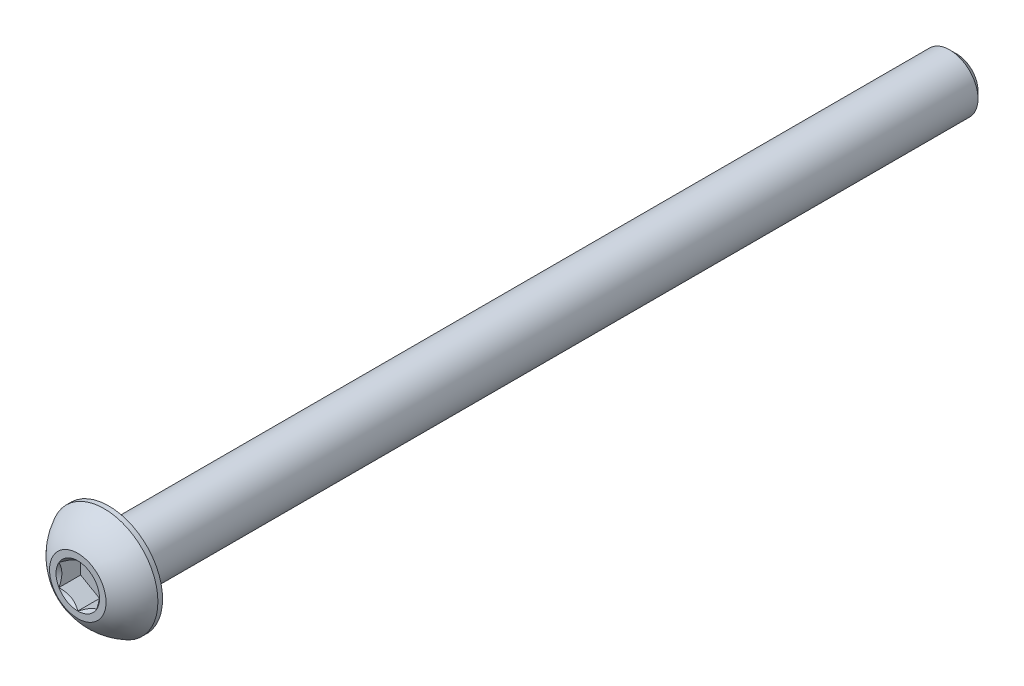
ISO-10303-21;
HEADER;
FILE_DESCRIPTION(('STEP AP214'),'2;1');
FILE_NAME('part.step','',(''),(''),'','','');
FILE_SCHEMA(('AUTOMOTIVE_DESIGN { 1 0 10303 214 1 1 1 1 }'));
ENDSEC;
DATA;
#1=APPLICATION_CONTEXT('core data for automotive mechanical design processes');
#2=APPLICATION_PROTOCOL_DEFINITION('international standard','automotive_design',2000,#1);
#3=PRODUCT_CONTEXT('',#1,'mechanical');
#4=PRODUCT('Part','Part','',(#3));
#5=PRODUCT_RELATED_PRODUCT_CATEGORY('part','',(#4));
#6=PRODUCT_DEFINITION_FORMATION('','',#4);
#7=PRODUCT_DEFINITION_CONTEXT('part definition',#1,'design');
#8=PRODUCT_DEFINITION('design','',#6,#7);
#9=PRODUCT_DEFINITION_SHAPE('','',#8);
#10=(LENGTH_UNIT() NAMED_UNIT(*) SI_UNIT(.MILLI.,.METRE.));
#11=(NAMED_UNIT(*) PLANE_ANGLE_UNIT() SI_UNIT($,.RADIAN.));
#12=(NAMED_UNIT(*) SI_UNIT($,.STERADIAN.) SOLID_ANGLE_UNIT());
#13=UNCERTAINTY_MEASURE_WITH_UNIT(LENGTH_MEASURE(1.E-05),#10,'distance_accuracy_value','');
#14=(GEOMETRIC_REPRESENTATION_CONTEXT(3) GLOBAL_UNCERTAINTY_ASSIGNED_CONTEXT((#13)) GLOBAL_UNIT_ASSIGNED_CONTEXT((#10,
#11,#12)) REPRESENTATION_CONTEXT('',''));
#15=CARTESIAN_POINT('',(0.,0.,0.));
#16=DIRECTION('',(0.,0.,1.));
#17=DIRECTION('',(1.,0.,0.));
#18=AXIS2_PLACEMENT_3D('',#15,#16,#17);
#19=CARTESIAN_POINT('',(0.,0.,-46.65));
#20=DIRECTION('',(0.,0.,1.));
#21=DIRECTION('',(1.,0.,0.));
#22=AXIS2_PLACEMENT_3D('',#19,#20,#21);
#23=PLANE('',#22);
#24=CARTESIAN_POINT('',(0.,0.,-46.65));
#25=DIRECTION('',(0.,0.,1.));
#26=DIRECTION('',(1.,0.,0.));
#27=AXIS2_PLACEMENT_3D('',#24,#25,#26);
#28=CIRCLE('',#27,1.12500000000003);
#29=CARTESIAN_POINT('',(1.12500000000003,0.,-46.65));
#30=VERTEX_POINT('',#29);
#31=EDGE_CURVE('E55',#30,#30,#28,.T.);
#32=ORIENTED_EDGE('',*,*,#31,.F.);
#33=EDGE_LOOP('',(#32));
#34=FACE_BOUND('',#33,.T.);
#35=ADVANCED_FACE('F41',(#34),#23,.F.);
#36=CARTESIAN_POINT('',(0.,0.,-46.65));
#37=DIRECTION('',(0.,0.,1.));
#38=DIRECTION('',(1.,0.,0.));
#39=AXIS2_PLACEMENT_3D('',#36,#37,#38);
#40=CONICAL_SURFACE('',#39,1.12500000000003,0.78539816339743);
#41=CARTESIAN_POINT('',(0.,0.,-46.275));
#42=DIRECTION('',(0.,0.,1.));
#43=DIRECTION('',(1.,0.,0.));
#44=AXIS2_PLACEMENT_3D('',#41,#42,#43);
#45=CIRCLE('',#44,1.50000000000002);
#46=CARTESIAN_POINT('',(1.50000000000002,0.,-46.275));
#47=VERTEX_POINT('',#46);
#48=EDGE_CURVE('E198',#47,#47,#45,.T.);
#49=ORIENTED_EDGE('',*,*,#48,.F.);
#50=EDGE_LOOP('',(#49));
#51=FACE_BOUND('',#50,.T.);
#52=ORIENTED_EDGE('',*,*,#31,.T.);
#53=EDGE_LOOP('',(#52));
#54=FACE_BOUND('',#53,.T.);
#55=ADVANCED_FACE('F205',(#51,#54),#40,.T.);
#56=CARTESIAN_POINT('',(0.,0.,0.));
#57=DIRECTION('',(0.,0.,1.));
#58=DIRECTION('',(1.,0.,0.));
#59=AXIS2_PLACEMENT_3D('',#56,#57,#58);
#60=CYLINDRICAL_SURFACE('',#59,1.50000000000002);
#61=CARTESIAN_POINT('',(0.,0.,-1.65));
#62=DIRECTION('',(0.,0.,1.));
#63=DIRECTION('',(1.,0.,0.));
#64=AXIS2_PLACEMENT_3D('',#61,#62,#63);
#65=CIRCLE('',#64,1.50000000000002);
#66=CARTESIAN_POINT('',(1.50000000000002,0.,-1.65));
#67=VERTEX_POINT('',#66);
#68=EDGE_CURVE('E194',#67,#67,#65,.T.);
#69=ORIENTED_EDGE('',*,*,#68,.F.);
#70=EDGE_LOOP('',(#69));
#71=FACE_BOUND('',#70,.T.);
#72=ORIENTED_EDGE('',*,*,#48,.T.);
#73=EDGE_LOOP('',(#72));
#74=FACE_BOUND('',#73,.T.);
#75=ADVANCED_FACE('F211',(#71,#74),#60,.T.);
#76=CARTESIAN_POINT('',(0.,-2.85,-1.65));
#77=DIRECTION('',(0.,0.,1.));
#78=DIRECTION('',(1.,0.,0.));
#79=AXIS2_PLACEMENT_3D('',#76,#77,#78);
#80=PLANE('',#79);
#81=CARTESIAN_POINT('',(0.,0.,-1.65));
#82=DIRECTION('',(0.,0.,1.));
#83=DIRECTION('',(1.,0.,0.));
#84=AXIS2_PLACEMENT_3D('',#81,#82,#83);
#85=CIRCLE('',#84,2.85);
#86=CARTESIAN_POINT('',(2.85,0.,-1.65));
#87=VERTEX_POINT('',#86);
#88=EDGE_CURVE('E186',#87,#87,#85,.T.);
#89=ORIENTED_EDGE('',*,*,#88,.F.);
#90=EDGE_LOOP('',(#89));
#91=FACE_BOUND('',#90,.T.);
#92=ORIENTED_EDGE('',*,*,#68,.T.);
#93=EDGE_LOOP('',(#92));
#94=FACE_BOUND('',#93,.T.);
#95=ADVANCED_FACE('F216',(#91,#94),#80,.F.);
#96=CARTESIAN_POINT('',(0.,0.,-2.79483288770053));
#97=DIRECTION('',(0.,0.,1.));
#98=DIRECTION('',(0.,-1.,0.));
#99=AXIS2_PLACEMENT_3D('',#96,#97,#98);
#100=SPHERICAL_SURFACE('',#99,3.17192226735975);
#101=CARTESIAN_POINT('',(0.,0.,0.));
#102=DIRECTION('',(0.,0.,1.));
#103=DIRECTION('',(1.,0.,0.));
#104=AXIS2_PLACEMENT_3D('',#101,#102,#103);
#105=CIRCLE('',#104,1.50000000000002);
#106=CARTESIAN_POINT('',(0.,-1.50000000000002,0.));
#107=VERTEX_POINT('',#106);
#108=EDGE_CURVE('E190',#107,#107,#105,.T.);
#109=CARTESIAN_POINT('',(0.,0.,-1.4025));
#110=DIRECTION('',(0.,0.,1.));
#111=DIRECTION('',(1.,0.,0.));
#112=AXIS2_PLACEMENT_3D('',#109,#110,#111);
#113=CIRCLE('',#112,2.85);
#114=CARTESIAN_POINT('',(0.,-2.85,-1.4025));
#115=VERTEX_POINT('',#114);
#116=EDGE_CURVE('E182',#115,#115,#113,.T.);
#117=CARTESIAN_POINT('',(0.,-1.50000000000002,0.));
#118=CARTESIAN_POINT('',(0.,-1.51816007989212,-0.009746569473365));
#119=CARTESIAN_POINT('',(0.,-1.53622513742982,-0.0196701847238474));
#120=CARTESIAN_POINT('',(0.,-1.57215840256596,-0.039867631129312));
#121=CARTESIAN_POINT('',(0.,-1.59002661016439,-0.0501414622842942));
#122=CARTESIAN_POINT('',(0.,-1.62555937019151,-0.0710354648490238));
#123=CARTESIAN_POINT('',(0.,-1.64322392262021,-0.0816556362587711));
#124=CARTESIAN_POINT('',(0.,-1.67834266450263,-0.103238276426968));
#125=CARTESIAN_POINT('',(0.,-1.69579685395637,-0.114200745185417));
#126=CARTESIAN_POINT('',(0.,-1.73048823664555,-0.136463816635607));
#127=CARTESIAN_POINT('',(0.,-1.747725429881,-0.147764419327348));
#128=CARTESIAN_POINT('',(0.,-1.78197627078177,-0.170699464187154));
#129=CARTESIAN_POINT('',(0.,-1.7989899184471,-0.18233390635522));
#130=CARTESIAN_POINT('',(0.,-1.83278720341136,-0.205932209546913));
#131=CARTESIAN_POINT('',(0.,-1.84957084071029,-0.217896070570541));
#132=CARTESIAN_POINT('',(0.,-1.88290172764637,-0.242148665498755));
#133=CARTESIAN_POINT('',(0.,-1.89944897728351,-0.254437399403342));
#134=CARTESIAN_POINT('',(0.,-1.9323008013937,-0.279335070725424));
#135=CARTESIAN_POINT('',(0.,-1.94860537586674,-0.291944008142921));
#136=CARTESIAN_POINT('',(0.,-1.98096565436366,-0.317477295441113));
#137=CARTESIAN_POINT('',(0.,-1.99702135838754,-0.330401645321808));
#138=CARTESIAN_POINT('',(0.,-2.02887779526297,-0.356560846652227));
#139=CARTESIAN_POINT('',(0.,-2.04467852811453,-0.36979569810195));
#140=CARTESIAN_POINT('',(0.,-2.07601901880465,-0.396570873693308));
#141=CARTESIAN_POINT('',(0.,-2.09155877664322,-0.410111197834944));
#142=CARTESIAN_POINT('',(0.,-2.12237141262986,-0.437492173862107));
#143=CARTESIAN_POINT('',(0.,-2.13764429077792,-0.451332825747635));
#144=CARTESIAN_POINT('',(0.,-2.16791736411296,-0.479309198198269));
#145=CARTESIAN_POINT('',(0.,-2.18291755929994,-0.493444918763376));
#146=CARTESIAN_POINT('',(0.,-2.21263956705415,-0.522006057390952));
#147=CARTESIAN_POINT('',(0.,-2.2273613796214,-0.53643147545342));
#148=CARTESIAN_POINT('',(0.,-2.25652102825521,-0.565566527816472));
#149=CARTESIAN_POINT('',(0.,-2.27095886432178,-0.580276162117056));
#150=CARTESIAN_POINT('',(0.,-2.2995450739765,-0.609974057702796));
#151=CARTESIAN_POINT('',(0.,-2.31369344756466,-0.624962318987953));
#152=CARTESIAN_POINT('',(0.,-2.34169535627252,-0.65521177341876));
#153=CARTESIAN_POINT('',(0.,-2.35554889139224,-0.670472966564411));
#154=CARTESIAN_POINT('',(0.,-2.38295585920366,-0.701262485885584));
#155=CARTESIAN_POINT('',(0.,-2.39650929189537,-0.716790812061106));
#156=CARTESIAN_POINT('',(0.,-2.42331090492182,-0.748108697108243));
#157=CARTESIAN_POINT('',(0.,-2.43655908525657,-0.763898255979859));
#158=CARTESIAN_POINT('',(0.,-2.46274515962755,-0.795732606824228));
#159=CARTESIAN_POINT('',(0.,-2.47568305366379,-0.811777398796981));
#160=CARTESIAN_POINT('',(0.,-2.50124363939651,-0.844116119267127));
#161=CARTESIAN_POINT('',(0.,-2.51386633109298,-0.86041004776452));
#162=CARTESIAN_POINT('',(0.,-2.53879171587279,-0.8932408500426));
#163=CARTESIAN_POINT('',(0.,-2.55109440895612,-0.909777723823287));
#164=CARTESIAN_POINT('',(0.,-2.57537512182785,-0.94308813311364));
#165=CARTESIAN_POINT('',(0.,-2.58735314161625,-0.959861668623306));
#166=CARTESIAN_POINT('',(0.,-2.61097995657956,-0.993639027894247));
#167=CARTESIAN_POINT('',(0.,-2.62262875175448,-1.01064285165552));
#168=CARTESIAN_POINT('',(0.,-2.64559269128199,-1.04487432644225));
#169=CARTESIAN_POINT('',(0.,-2.65690783563458,-1.06210197746771));
#170=CARTESIAN_POINT('',(0.,-2.67920017403639,-1.09677456077299));
#171=CARTESIAN_POINT('',(0.,-2.69017736808561,-1.11421949305282));
#172=CARTESIAN_POINT('',(0.,-2.711789634999,-1.14932001019995));
#173=CARTESIAN_POINT('',(0.,-2.72242470786316,-1.16697559506725));
#174=CARTESIAN_POINT('',(0.,-2.74334869082118,-1.20249070903943));
#175=CARTESIAN_POINT('',(0.,-2.75363760091502,-1.22035023814429));
#176=CARTESIAN_POINT('',(0.,-2.77386535089241,-1.25626645340824));
#177=CARTESIAN_POINT('',(0.,-2.78380419077596,-1.27432313956732));
#178=CARTESIAN_POINT('',(0.,-2.80332801615778,-1.31062681184411));
#179=CARTESIAN_POINT('',(0.,-2.81291300165605,-1.32887379796182));
#180=CARTESIAN_POINT('',(0.,-2.83172550494215,-1.3655511220839));
#181=CARTESIAN_POINT('',(0.,-2.84095302272998,-1.38398146008827));
#182=CARTESIAN_POINT('',(0.,-2.85,-1.4025));
#183=B_SPLINE_CURVE_WITH_KNOTS('',3,(#117,#118,#119,#120,#121,#122,#123,#124,#125,#126,#127,
#128,#129,#130,#131,#132,#133,#134,#135,#136,#137,#138,#139,#140,#141,#142,#143,#144,#145,#146,
#147,#148,#149,#150,#151,#152,#153,#154,#155,#156,#157,#158,#159,#160,#161,#162,#163,#164,#165,
#166,#167,#168,#169,#170,#171,#172,#173,#174,#175,#176,#177,#178,#179,#180,#181,#182),
.UNSPECIFIED.,.F.,.F.,(4,2,2,2,2,2,2,2,2,2,2,2,2,2,2,2,2,2,2,2,2,2,2,2,2,2,2,2,2,2,2,2,4),(0.,
0.061829894182698,0.123659788365395,0.185489682548094,0.247319576730792,0.30914947091349,
0.370979365096188,0.432809259278885,0.494639153461583,0.556469047644282,0.618298941826979,
0.680128836009677,0.741958730192375,0.803788624375073,0.865618518557771,0.927448412740469,
0.989278306923166,1.05110820110586,1.11293809528856,1.17476798947126,1.23659788365396,
1.29842777783666,1.36025767201935,1.42208756620205,1.48391746038475,1.54574735456745,
1.60757724875015,1.66940714293284,1.73123703711554,1.79306693129824,1.85489682548094,
1.91672671966364,1.97855661384633),.UNSPECIFIED.);
#184=EDGE_CURVE('BSEAM221',#107,#115,#183,.T.);
#185=ORIENTED_EDGE('',*,*,#108,.F.);
#186=ORIENTED_EDGE('',*,*,#116,.T.);
#187=ORIENTED_EDGE('',*,*,#184,.T.);
#188=ORIENTED_EDGE('',*,*,#184,.F.);
#189=EDGE_LOOP('',(#185,#187,#186,#188));
#190=FACE_BOUND('',#189,.T.);
#191=ADVANCED_FACE('F221',(#190),#100,.T.);
#192=CARTESIAN_POINT('',(0.,-1.50000000000002,0.));
#193=DIRECTION('',(0.,0.,-1.));
#194=DIRECTION('',(-1.,0.,0.));
#195=AXIS2_PLACEMENT_3D('',#192,#193,#194);
#196=PLANE('',#195);
#197=CARTESIAN_POINT('',(0.,0.,0.));
#198=DIRECTION('',(0.,0.,1.));
#199=DIRECTION('',(1.,0.,0.));
#200=AXIS2_PLACEMENT_3D('',#197,#198,#199);
#201=CIRCLE('',#200,1.15470053837925);
#202=CARTESIAN_POINT('',(-0.999999999999997,0.577350269189625,0.));
#203=VERTEX_POINT('',#202);
#204=CARTESIAN_POINT('',(-0.999999999999997,-0.577350269189627,0.));
#205=VERTEX_POINT('',#204);
#206=EDGE_CURVE('E68',#203,#205,#201,.T.);
#207=ORIENTED_EDGE('',*,*,#206,.F.);
#208=CARTESIAN_POINT('',(0.,1.15470053837925,0.));
#209=VERTEX_POINT('',#208);
#210=EDGE_CURVE('E145',#209,#203,#201,.T.);
#211=ORIENTED_EDGE('',*,*,#210,.F.);
#212=CARTESIAN_POINT('',(1.,0.57735026918962,0.));
#213=VERTEX_POINT('',#212);
#214=EDGE_CURVE('E140',#213,#209,#201,.T.);
#215=ORIENTED_EDGE('',*,*,#214,.F.);
#216=CARTESIAN_POINT('',(1.,-0.577350269189621,0.));
#217=VERTEX_POINT('',#216);
#218=EDGE_CURVE('E109',#217,#213,#201,.T.);
#219=ORIENTED_EDGE('',*,*,#218,.F.);
#220=CARTESIAN_POINT('',(0.,-1.15470053837925,0.));
#221=VERTEX_POINT('',#220);
#222=EDGE_CURVE('E100',#221,#217,#201,.T.);
#223=ORIENTED_EDGE('',*,*,#222,.F.);
#224=EDGE_CURVE('E61',#205,#221,#201,.T.);
#225=ORIENTED_EDGE('',*,*,#224,.F.);
#226=EDGE_LOOP('',(#207,#211,#215,#219,#223,#225));
#227=FACE_BOUND('',#226,.T.);
#228=ORIENTED_EDGE('',*,*,#108,.T.);
#229=EDGE_LOOP('',(#228));
#230=FACE_BOUND('',#229,.T.);
#231=ADVANCED_FACE('F137',(#227,#230),#196,.F.);
#232=CARTESIAN_POINT('',(0.,0.,0.));
#233=DIRECTION('',(0.,0.,1.));
#234=DIRECTION('',(1.,0.,0.));
#235=AXIS2_PLACEMENT_3D('',#232,#233,#234);
#236=CYLINDRICAL_SURFACE('',#235,2.85);
#237=ORIENTED_EDGE('',*,*,#116,.F.);
#238=EDGE_LOOP('',(#237));
#239=FACE_BOUND('',#238,.T.);
#240=ORIENTED_EDGE('',*,*,#88,.T.);
#241=EDGE_LOOP('',(#240));
#242=FACE_BOUND('',#241,.T.);
#243=ADVANCED_FACE('F227',(#239,#242),#236,.T.);
#244=CARTESIAN_POINT('',(0.,0.,0.));
#245=DIRECTION('',(0.,0.,1.));
#246=DIRECTION('',(1.,0.,0.));
#247=AXIS2_PLACEMENT_3D('',#244,#245,#246);
#248=CONICAL_SURFACE('',#247,1.15470053837925,0.78539816339745);
#249=ORIENTED_EDGE('',*,*,#218,.T.);
#250=CARTESIAN_POINT('',(1.,-1.15147208646461,0.370385677513857));
#251=CARTESIAN_POINT('',(1.,-1.12343447988551,0.349219919873708));
#252=CARTESIAN_POINT('',(1.,-1.09524064850696,0.328261692175906));
#253=CARTESIAN_POINT('',(1.,-1.03847715644375,0.286846022235618));
#254=CARTESIAN_POINT('',(1.,-1.00990740382974,0.266388706123655));
#255=CARTESIAN_POINT('',(1.,-0.92312089433347,0.205604794954506));
#256=CARTESIAN_POINT('',(1.,-0.864253173759053,0.166192228961395));
#257=CARTESIAN_POINT('',(1.,-0.74080985825804,0.0888206642002037));
#258=CARTESIAN_POINT('',(1.,-0.676100255137802,0.0510730391143415));
#259=CARTESIAN_POINT('',(1.,-0.54344893904912,-0.0179754124487081));
#260=CARTESIAN_POINT('',(1.,-0.475519112027775,-0.049297972153134));
#261=CARTESIAN_POINT('',(1.,-0.373555850333526,-0.0876182211162039));
#262=CARTESIAN_POINT('',(1.,-0.341031989670905,-0.0986164083578424));
#263=CARTESIAN_POINT('',(1.,-0.275199079052291,-0.118001657852638));
#264=CARTESIAN_POINT('',(1.,-0.24188997517393,-0.126388540223299));
#265=CARTESIAN_POINT('',(1.,-0.17524751704299,-0.139974779280982));
#266=CARTESIAN_POINT('',(1.,-0.141925568218173,-0.145229209232031));
#267=CARTESIAN_POINT('',(1.,-0.0749144362322771,-0.152451313429106));
#268=CARTESIAN_POINT('',(1.,-0.0412251978501601,-0.15441848638949));
#269=CARTESIAN_POINT('',(1.,0.0249580992634224,-0.154916801606837));
#270=CARTESIAN_POINT('',(1.,0.0574512826460405,-0.153569732111363));
#271=CARTESIAN_POINT('',(1.,0.122148505701868,-0.147783515501013));
#272=CARTESIAN_POINT('',(1.,0.154352610132927,-0.143345079338462));
#273=CARTESIAN_POINT('',(1.,0.21879989886764,-0.131543169854794));
#274=CARTESIAN_POINT('',(1.,0.251033743268954,-0.124129458961488));
#275=CARTESIAN_POINT('',(1.,0.314797132354919,-0.106771057501322));
#276=CARTESIAN_POINT('',(1.,0.346326735731005,-0.0968265787111677));
#277=CARTESIAN_POINT('',(1.,0.445594187730205,-0.0617765174456608));
#278=CARTESIAN_POINT('',(1.,0.511919139476036,-0.0326791416432731));
#279=CARTESIAN_POINT('',(1.,0.641453244657532,0.0320153296865072));
#280=CARTESIAN_POINT('',(1.,0.704650133126345,0.0676357767152442));
#281=CARTESIAN_POINT('',(1.,0.825428490174987,0.141123901346938));
#282=CARTESIAN_POINT('',(1.,0.883132947867685,0.178791947135466));
#283=CARTESIAN_POINT('',(1.,0.968148853704565,0.237022852943166));
#284=CARTESIAN_POINT('',(1.,0.996120570380285,0.256638475762859));
#285=CARTESIAN_POINT('',(1.,1.05168177729901,0.296388517061273));
#286=CARTESIAN_POINT('',(1.,1.079271369977,0.316522792198834));
#287=CARTESIAN_POINT('',(1.,1.10670185346329,0.336872119072974));
#288=B_SPLINE_CURVE_WITH_KNOTS('',3,(#250,#251,#252,#253,#254,#255,#256,#257,#258,#259,#260,
#261,#262,#263,#264,#265,#266,#267,#268,#269,#270,#271,#272,#273,#274,#275,#276,#277,#278,#279,
#280,#281,#282,#283,#284,#285,#286,#287),.UNSPECIFIED.,.F.,.F.,(4,2,2,2,2,2,2,2,2,2,2,2,2,2,2,2,
2,2,4),(0.,0.10538645908329,0.210799187330123,0.423233611565466,0.647793540908498,
0.871580877738603,0.974493074181413,1.077412358272,1.17846428203204,1.27953161415761,
1.37694086739609,1.47432772585407,1.57343322804292,1.6725304397285,1.88917353996826,
2.10660791038812,2.31323734249842,2.41572589232043,2.51818641476502),.UNSPECIFIED.);
#289=EDGE_CURVE('E11',#217,#213,#288,.T.);
#290=ORIENTED_EDGE('',*,*,#289,.F.);
#291=EDGE_LOOP('',(#249,#290));
#292=FACE_BOUND('',#291,.T.);
#293=ADVANCED_FACE('F113',(#292),#248,.F.);
#294=ORIENTED_EDGE('',*,*,#214,.T.);
#295=CARTESIAN_POINT('',(1.0002,0.577234799135786,0.000115487372616175));
#296=CARTESIAN_POINT('',(0.96581740499282,0.59708559961862,-0.0197220691742649));
#297=CARTESIAN_POINT('',(0.930859881860175,0.617268335009455,-0.0383949793611092));
#298=CARTESIAN_POINT('',(0.85957719704391,0.658423412276684,-0.0725852572768405));
#299=CARTESIAN_POINT('',(0.823245249471016,0.679399671988078,-0.0880835909765399));
#300=CARTESIAN_POINT('',(0.749983386196688,0.721697428470845,-0.114632692857734));
#301=CARTESIAN_POINT('',(0.713072148554585,0.743008141459635,-0.125750226003073));
#302=CARTESIAN_POINT('',(0.63843727068914,0.786098608286185,-0.142880134223817));
#303=CARTESIAN_POINT('',(0.600715911891363,0.80787704494228,-0.148905302533326));
#304=CARTESIAN_POINT('',(0.535707801582065,0.845409494928862,-0.154339445032505));
#305=CARTESIAN_POINT('',(0.508505628471827,0.8611146768966,-0.155143061683267));
#306=CARTESIAN_POINT('',(0.454153959330887,0.892494627706028,-0.153793300583112));
#307=CARTESIAN_POINT('',(0.427004476245123,0.908169389073952,-0.1516392704528));
#308=CARTESIAN_POINT('',(0.345943722673039,0.954969836969509,-0.140883027871528));
#309=CARTESIAN_POINT('',(0.292435859021572,0.985862616452446,-0.127985443584643));
#310=CARTESIAN_POINT('',(0.198523934856568,1.04008269114923,-0.0968592693978221));
#311=CARTESIAN_POINT('',(0.157679476328165,1.0636642502755,-0.0802622022981601));
#312=CARTESIAN_POINT('',(0.0775903626180563,1.10990372163519,-0.042875075314707));
#313=CARTESIAN_POINT('',(0.0383409891295625,1.1325643579843,-0.0220986581825966));
#314=CARTESIAN_POINT('',(-0.000199999999999514,1.15481600843309,0.000115487372613833));
#315=B_SPLINE_CURVE_WITH_KNOTS('',3,(#295,#296,#297,#298,#299,#300,#301,#302,#303,#304,#305,
#306,#307,#308,#309,#310,#311,#312,#313,#314),.UNSPECIFIED.,.F.,.F.,(4,2,2,2,2,2,2,2,2,4),(0.,
0.13323767682856,0.267252229834491,0.399137076269302,0.53068960328077,0.624814864263848,
0.718960890149135,0.907306626112099,1.05710100361789,1.20641411519286),.UNSPECIFIED.);
#316=EDGE_CURVE('E144',#213,#209,#315,.T.);
#317=ORIENTED_EDGE('',*,*,#316,.F.);
#318=EDGE_LOOP('',(#294,#317));
#319=FACE_BOUND('',#318,.T.);
#320=ADVANCED_FACE('F323',(#319),#248,.F.);
#321=ORIENTED_EDGE('',*,*,#210,.T.);
#322=CARTESIAN_POINT('',(0.000200000000000433,1.15481600843309,0.000115487372613877));
#323=CARTESIAN_POINT('',(-0.0341825950071802,1.13496520795025,-0.019722069174267));
#324=CARTESIAN_POINT('',(-0.0691401181398243,1.11478247255942,-0.0383949793611112));
#325=CARTESIAN_POINT('',(-0.140422802956089,1.07362739529219,-0.0725852572768422));
#326=CARTESIAN_POINT('',(-0.176754750528983,1.0526511355808,-0.0880835909765415));
#327=CARTESIAN_POINT('',(-0.25001661380331,1.01035337909803,-0.114632692857735));
#328=CARTESIAN_POINT('',(-0.286927851445413,0.989042666109238,-0.125750226003074));
#329=CARTESIAN_POINT('',(-0.361562729310858,0.945952199282689,-0.142880134223818));
#330=CARTESIAN_POINT('',(-0.399284088108635,0.924173762626594,-0.148905302533327));
#331=CARTESIAN_POINT('',(-0.464292198417932,0.886641312640012,-0.154339445032506));
#332=CARTESIAN_POINT('',(-0.491494371528171,0.870936130672273,-0.155143061683268));
#333=CARTESIAN_POINT('',(-0.54584604066911,0.839556179862846,-0.153793300583113));
#334=CARTESIAN_POINT('',(-0.572995523754874,0.823881418494921,-0.151639270452801));
#335=CARTESIAN_POINT('',(-0.654056277326958,0.777080970599365,-0.140883027871529));
#336=CARTESIAN_POINT('',(-0.707564140978425,0.746188191116428,-0.127985443584644));
#337=CARTESIAN_POINT('',(-0.801476065143429,0.691968116419648,-0.096859269397823));
#338=CARTESIAN_POINT('',(-0.842320523671832,0.66838655729337,-0.080262202298161));
#339=CARTESIAN_POINT('',(-0.922409637381941,0.62214708593368,-0.0428750753147078));
#340=CARTESIAN_POINT('',(-0.961659010870435,0.599486449584574,-0.0220986581825973));
#341=CARTESIAN_POINT('',(-1.0002,0.577234799135787,0.00011548737261326));
#342=B_SPLINE_CURVE_WITH_KNOTS('',3,(#322,#323,#324,#325,#326,#327,#328,#329,#330,#331,#332,
#333,#334,#335,#336,#337,#338,#339,#340,#341),.UNSPECIFIED.,.F.,.F.,(4,2,2,2,2,2,2,2,2,4),(0.,
0.133237676828559,0.26725222983449,0.399137076269299,0.530689603280767,0.624814864263845,
0.718960890149132,0.907306626112096,1.05710100361789,1.20641411519286),.UNSPECIFIED.);
#343=EDGE_CURVE('E151',#209,#203,#342,.T.);
#344=ORIENTED_EDGE('',*,*,#343,.F.);
#345=EDGE_LOOP('',(#321,#344));
#346=FACE_BOUND('',#345,.T.);
#347=ADVANCED_FACE('F156',(#346),#248,.F.);
#348=ORIENTED_EDGE('',*,*,#206,.T.);
#349=CARTESIAN_POINT('',(-0.999999999999996,-1.15147208646461,0.370385677513859));
#350=CARTESIAN_POINT('',(-0.999999999999996,-1.12343447988552,0.34921991987371));
#351=CARTESIAN_POINT('',(-0.999999999999996,-1.09524064850697,0.328261692175907));
#352=CARTESIAN_POINT('',(-0.999999999999996,-1.03847715644376,0.286846022235619));
#353=CARTESIAN_POINT('',(-0.999999999999996,-1.00990740382975,0.266388706123656));
#354=CARTESIAN_POINT('',(-0.999999999999996,-0.923120894333474,0.205604794954507));
#355=CARTESIAN_POINT('',(-0.999999999999997,-0.864253173759057,0.166192228961396));
#356=CARTESIAN_POINT('',(-0.999999999999997,-0.740809858258044,0.0888206642002033));
#357=CARTESIAN_POINT('',(-0.999999999999997,-0.676100255137805,0.0510730391143406));
#358=CARTESIAN_POINT('',(-0.999999999999997,-0.543448939049123,-0.0179754124487097));
#359=CARTESIAN_POINT('',(-0.999999999999997,-0.475519112027777,-0.049297972153136));
#360=CARTESIAN_POINT('',(-0.999999999999997,-0.373555850333528,-0.0876182211162064));
#361=CARTESIAN_POINT('',(-0.999999999999997,-0.341031989670907,-0.098616408357845));
#362=CARTESIAN_POINT('',(-0.999999999999997,-0.275199079052293,-0.118001657852641));
#363=CARTESIAN_POINT('',(-0.999999999999997,-0.241889975173932,-0.126388540223302));
#364=CARTESIAN_POINT('',(-0.999999999999997,-0.175247517042992,-0.139974779280985));
#365=CARTESIAN_POINT('',(-0.999999999999997,-0.141925568218175,-0.145229209232034));
#366=CARTESIAN_POINT('',(-0.999999999999997,-0.0749144362322791,-0.152451313429109));
#367=CARTESIAN_POINT('',(-0.999999999999997,-0.041225197850162,-0.154418486389493));
#368=CARTESIAN_POINT('',(-0.999999999999997,0.0249580992634205,-0.15491680160684));
#369=CARTESIAN_POINT('',(-0.999999999999997,0.0574512826460387,-0.153569732111367));
#370=CARTESIAN_POINT('',(-0.999999999999997,0.122148505701866,-0.147783515501016));
#371=CARTESIAN_POINT('',(-0.999999999999997,0.154352610132926,-0.143345079338466));
#372=CARTESIAN_POINT('',(-0.999999999999997,0.218799898867639,-0.131543169854798));
#373=CARTESIAN_POINT('',(-0.999999999999997,0.251033743268952,-0.124129458961492));
#374=CARTESIAN_POINT('',(-0.999999999999997,0.314797132354917,-0.106771057501326));
#375=CARTESIAN_POINT('',(-0.999999999999997,0.346326735731003,-0.0968265787111716));
#376=CARTESIAN_POINT('',(-0.999999999999997,0.445594187730203,-0.0617765174456648));
#377=CARTESIAN_POINT('',(-0.999999999999997,0.511919139476034,-0.0326791416432772));
#378=CARTESIAN_POINT('',(-0.999999999999997,0.641453244657529,0.0320153296865026));
#379=CARTESIAN_POINT('',(-0.999999999999997,0.704650133126341,0.0676357767152392));
#380=CARTESIAN_POINT('',(-0.999999999999997,0.825428490174983,0.141123901346932));
#381=CARTESIAN_POINT('',(-0.999999999999997,0.883132947867681,0.17879194713546));
#382=CARTESIAN_POINT('',(-0.999999999999997,0.968148853704561,0.23702285294316));
#383=CARTESIAN_POINT('',(-0.999999999999997,0.99612057038028,0.256638475762853));
#384=CARTESIAN_POINT('',(-0.999999999999997,1.05168177729901,0.296388517061267));
#385=CARTESIAN_POINT('',(-0.999999999999997,1.079271369977,0.316522792198828));
#386=CARTESIAN_POINT('',(-0.999999999999997,1.10670185346329,0.336872119072968));
#387=B_SPLINE_CURVE_WITH_KNOTS('',3,(#349,#350,#351,#352,#353,#354,#355,#356,#357,#358,#359,
#360,#361,#362,#363,#364,#365,#366,#367,#368,#369,#370,#371,#372,#373,#374,#375,#376,#377,#378,
#379,#380,#381,#382,#383,#384,#385,#386),.UNSPECIFIED.,.F.,.F.,(4,2,2,2,2,2,2,2,2,2,2,2,2,2,2,2,
2,2,4),(0.,0.10538645908329,0.210799187330124,0.423233611565468,0.647793540908502,
0.871580877738608,0.974493074181418,1.07741235827201,1.17846428203204,1.27953161415762,
1.3769408673961,1.47432772585407,1.57343322804293,1.67253043972851,1.88917353996827,
2.10660791038812,2.31323734249843,2.41572589232044,2.51818641476502),.UNSPECIFIED.);
#388=EDGE_CURVE('E161',#203,#205,#387,.F.);
#389=ORIENTED_EDGE('',*,*,#388,.F.);
#390=EDGE_LOOP('',(#348,#389));
#391=FACE_BOUND('',#390,.T.);
#392=ADVANCED_FACE('F317',(#391),#248,.F.);
#393=ORIENTED_EDGE('',*,*,#224,.T.);
#394=CARTESIAN_POINT('',(-1.0002,-0.577234799135786,0.000115487372612706));
#395=CARTESIAN_POINT('',(-0.965817404992816,-0.59708559961862,-0.0197220691742684));
#396=CARTESIAN_POINT('',(-0.930859881860172,-0.617268335009454,-0.0383949793611125));
#397=CARTESIAN_POINT('',(-0.859577197043907,-0.658423412276684,-0.0725852572768433));
#398=CARTESIAN_POINT('',(-0.823245249471013,-0.679399671988078,-0.0880835909765424));
#399=CARTESIAN_POINT('',(-0.749983386196686,-0.721697428470844,-0.114632692857736));
#400=CARTESIAN_POINT('',(-0.713072148554583,-0.743008141459635,-0.125750226003075));
#401=CARTESIAN_POINT('',(-0.638437270689138,-0.786098608286184,-0.142880134223819));
#402=CARTESIAN_POINT('',(-0.600715911891361,-0.807877044942279,-0.148905302533328));
#403=CARTESIAN_POINT('',(-0.535707801582064,-0.84540949492886,-0.154339445032507));
#404=CARTESIAN_POINT('',(-0.508505628471825,-0.861114676896599,-0.155143061683269));
#405=CARTESIAN_POINT('',(-0.454153959330885,-0.892494627706026,-0.153793300583114));
#406=CARTESIAN_POINT('',(-0.427004476245122,-0.908169389073951,-0.151639270452802));
#407=CARTESIAN_POINT('',(-0.345943722673037,-0.954969836969508,-0.14088302787153));
#408=CARTESIAN_POINT('',(-0.29243585902157,-0.985862616452444,-0.127985443584645));
#409=CARTESIAN_POINT('',(-0.198523934856567,-1.04008269114922,-0.0968592693978238));
#410=CARTESIAN_POINT('',(-0.157679476328164,-1.0636642502755,-0.0802622022981617));
#411=CARTESIAN_POINT('',(-0.0775903626180547,-1.10990372163519,-0.0428750753147082));
#412=CARTESIAN_POINT('',(-0.0383409891295607,-1.1325643579843,-0.0220986581825977));
#413=CARTESIAN_POINT('',(0.000200000000001427,-1.15481600843309,0.000115487372612954));
#414=B_SPLINE_CURVE_WITH_KNOTS('',3,(#394,#395,#396,#397,#398,#399,#400,#401,#402,#403,#404,
#405,#406,#407,#408,#409,#410,#411,#412,#413),.UNSPECIFIED.,.F.,.F.,(4,2,2,2,2,2,2,2,2,4),(0.,
0.133237676828559,0.26725222983449,0.399137076269299,0.530689603280767,0.624814864263845,
0.718960890149132,0.907306626112096,1.05710100361789,1.20641411519286),.UNSPECIFIED.);
#415=EDGE_CURVE('E126',#205,#221,#414,.T.);
#416=ORIENTED_EDGE('',*,*,#415,.F.);
#417=EDGE_LOOP('',(#393,#416));
#418=FACE_BOUND('',#417,.T.);
#419=ADVANCED_FACE('F256',(#418),#248,.F.);
#420=ORIENTED_EDGE('',*,*,#222,.T.);
#421=CARTESIAN_POINT('',(-0.000199999999998591,-1.15481600843309,0.00011548737261301));
#422=CARTESIAN_POINT('',(0.0341825950071819,-1.13496520795025,-0.0197220691742678));
#423=CARTESIAN_POINT('',(0.0691401181398259,-1.11478247255942,-0.0383949793611118));
#424=CARTESIAN_POINT('',(0.14042280295609,-1.07362739529219,-0.0725852572768426));
#425=CARTESIAN_POINT('',(0.176754750528985,-1.05265113558079,-0.0880835909765418));
#426=CARTESIAN_POINT('',(0.250016613803312,-1.01035337909803,-0.114632692857735));
#427=CARTESIAN_POINT('',(0.286927851445415,-0.989042666109238,-0.125750226003074));
#428=CARTESIAN_POINT('',(0.361562729310859,-0.945952199282688,-0.142880134223818));
#429=CARTESIAN_POINT('',(0.399284088108636,-0.924173762626594,-0.148905302533327));
#430=CARTESIAN_POINT('',(0.464292198417933,-0.886641312640012,-0.154339445032506));
#431=CARTESIAN_POINT('',(0.491494371528172,-0.870936130672273,-0.155143061683268));
#432=CARTESIAN_POINT('',(0.545846040669111,-0.839556179862846,-0.153793300583113));
#433=CARTESIAN_POINT('',(0.572995523754875,-0.823881418494921,-0.151639270452801));
#434=CARTESIAN_POINT('',(0.654056277326959,-0.777080970599364,-0.140883027871529));
#435=CARTESIAN_POINT('',(0.707564140978426,-0.746188191116428,-0.127985443584645));
#436=CARTESIAN_POINT('',(0.801476065143431,-0.691968116419647,-0.0968592693978229));
#437=CARTESIAN_POINT('',(0.842320523671833,-0.668386557293369,-0.0802622022981606));
#438=CARTESIAN_POINT('',(0.922409637381943,-0.622147085933678,-0.0428750753147068));
#439=CARTESIAN_POINT('',(0.961659010870437,-0.599486449584572,-0.022098658182596));
#440=CARTESIAN_POINT('',(1.0002,-0.577234799135784,0.00011548737261471));
#441=B_SPLINE_CURVE_WITH_KNOTS('',3,(#421,#422,#423,#424,#425,#426,#427,#428,#429,#430,#431,
#432,#433,#434,#435,#436,#437,#438,#439,#440),.UNSPECIFIED.,.F.,.F.,(4,2,2,2,2,2,2,2,2,4),(0.,
0.133237676828559,0.267252229834489,0.399137076269299,0.530689603280766,0.624814864263844,
0.71896089014913,0.907306626112094,1.05710100361789,1.20641411519286),.UNSPECIFIED.);
#442=EDGE_CURVE('E104',#221,#217,#441,.T.);
#443=ORIENTED_EDGE('',*,*,#442,.F.);
#444=EDGE_LOOP('',(#420,#443));
#445=FACE_BOUND('',#444,.T.);
#446=ADVANCED_FACE('F102',(#445),#248,.F.);
#447=CARTESIAN_POINT('',(1.,-0.577350269189622,-1.155));
#448=DIRECTION('',(0.,0.,1.));
#449=DIRECTION('',(1.,0.,0.));
#450=AXIS2_PLACEMENT_3D('',#447,#448,#449);
#451=PLANE('',#450);
#452=DIRECTION('',(0.866025403784438,0.5,0.));
#453=VECTOR('',#452,1.);
#454=CARTESIAN_POINT('',(0.,-1.15470053837925,-1.155));
#455=LINE('',#454,#453);
#456=CARTESIAN_POINT('',(0.,-1.15470053837925,-1.155));
#457=VERTEX_POINT('',#456);
#458=CARTESIAN_POINT('',(1.,-0.577350269189622,-1.155));
#459=VERTEX_POINT('',#458);
#460=EDGE_CURVE('E125',#457,#459,#455,.T.);
#461=ORIENTED_EDGE('',*,*,#460,.T.);
#462=DIRECTION('',(0.,1.,0.));
#463=VECTOR('',#462,1.);
#464=CARTESIAN_POINT('',(1.,-0.577350269189622,-1.155));
#465=LINE('',#464,#463);
#466=CARTESIAN_POINT('',(1.,0.577350269189624,-1.155));
#467=VERTEX_POINT('',#466);
#468=EDGE_CURVE('E130',#459,#467,#465,.T.);
#469=ORIENTED_EDGE('',*,*,#468,.T.);
#470=DIRECTION('',(-0.866025403784439,0.499999999999999,0.));
#471=VECTOR('',#470,1.);
#472=CARTESIAN_POINT('',(1.,0.577350269189624,-1.155));
#473=LINE('',#472,#471);
#474=CARTESIAN_POINT('',(0.,1.15470053837925,-1.155));
#475=VERTEX_POINT('',#474);
#476=EDGE_CURVE('E301',#467,#475,#473,.T.);
#477=ORIENTED_EDGE('',*,*,#476,.T.);
#478=DIRECTION('',(-0.866025403784439,-0.5,0.));
#479=VECTOR('',#478,1.);
#480=CARTESIAN_POINT('',(0.,1.15470053837925,-1.155));
#481=LINE('',#480,#479);
#482=CARTESIAN_POINT('',(-0.999999999999997,0.577350269189625,-1.155));
#483=VERTEX_POINT('',#482);
#484=EDGE_CURVE('E170',#475,#483,#481,.T.);
#485=ORIENTED_EDGE('',*,*,#484,.T.);
#486=DIRECTION('',(0.,-1.,0.));
#487=VECTOR('',#486,1.);
#488=CARTESIAN_POINT('',(-0.999999999999997,0.577350269189625,-1.155));
#489=LINE('',#488,#487);
#490=CARTESIAN_POINT('',(-0.999999999999997,-0.577350269189624,-1.155));
#491=VERTEX_POINT('',#490);
#492=EDGE_CURVE('E307',#483,#491,#489,.T.);
#493=ORIENTED_EDGE('',*,*,#492,.T.);
#494=DIRECTION('',(0.866025403784439,-0.5,0.));
#495=VECTOR('',#494,1.);
#496=CARTESIAN_POINT('',(-0.999999999999997,-0.577350269189624,-1.155));
#497=LINE('',#496,#495);
#498=EDGE_CURVE('E134',#491,#457,#497,.T.);
#499=ORIENTED_EDGE('',*,*,#498,.T.);
#500=EDGE_LOOP('',(#461,#469,#477,#485,#493,#499));
#501=FACE_BOUND('',#500,.T.);
#502=ADVANCED_FACE('F255',(#501),#451,.T.);
#503=CARTESIAN_POINT('',(1.,-0.577350269189622,-1.155));
#504=DIRECTION('',(1.,0.,0.));
#505=DIRECTION('',(0.,1.,0.));
#506=AXIS2_PLACEMENT_3D('',#503,#504,#505);
#507=PLANE('',#506);
#508=DIRECTION('',(0.,0.,1.));
#509=VECTOR('',#508,1.);
#510=CARTESIAN_POINT('',(1.,-0.577350269189622,-1.155));
#511=LINE('',#510,#509);
#512=EDGE_CURVE('E121',#459,#217,#511,.T.);
#513=ORIENTED_EDGE('',*,*,#512,.T.);
#514=ORIENTED_EDGE('',*,*,#289,.T.);
#515=DIRECTION('',(0.,0.,1.));
#516=VECTOR('',#515,1.);
#517=CARTESIAN_POINT('',(1.,0.577350269189624,-1.155));
#518=LINE('',#517,#516);
#519=EDGE_CURVE('E133',#467,#213,#518,.T.);
#520=ORIENTED_EDGE('',*,*,#519,.F.);
#521=ORIENTED_EDGE('',*,*,#468,.F.);
#522=EDGE_LOOP('',(#513,#514,#520,#521));
#523=FACE_BOUND('',#522,.T.);
#524=ADVANCED_FACE('F128',(#523),#507,.F.);
#525=CARTESIAN_POINT('',(1.,0.577350269189624,-1.155));
#526=DIRECTION('',(0.499999999999999,0.866025403784439,0.));
#527=DIRECTION('',(-0.866025403784439,0.499999999999999,0.));
#528=AXIS2_PLACEMENT_3D('',#525,#526,#527);
#529=PLANE('',#528);
#530=ORIENTED_EDGE('',*,*,#519,.T.);
#531=ORIENTED_EDGE('',*,*,#316,.T.);
#532=DIRECTION('',(0.,0.,1.));
#533=VECTOR('',#532,1.);
#534=CARTESIAN_POINT('',(0.,1.15470053837925,-1.155));
#535=LINE('',#534,#533);
#536=EDGE_CURVE('E166',#475,#209,#535,.T.);
#537=ORIENTED_EDGE('',*,*,#536,.F.);
#538=ORIENTED_EDGE('',*,*,#476,.F.);
#539=EDGE_LOOP('',(#530,#531,#537,#538));
#540=FACE_BOUND('',#539,.T.);
#541=ADVANCED_FACE('F164',(#540),#529,.F.);
#542=CARTESIAN_POINT('',(0.,1.15470053837925,-1.155));
#543=DIRECTION('',(-0.5,0.866025403784439,0.));
#544=DIRECTION('',(-0.866025403784439,-0.5,0.));
#545=AXIS2_PLACEMENT_3D('',#542,#543,#544);
#546=PLANE('',#545);
#547=ORIENTED_EDGE('',*,*,#536,.T.);
#548=ORIENTED_EDGE('',*,*,#343,.T.);
#549=DIRECTION('',(0.,0.,1.));
#550=VECTOR('',#549,1.);
#551=CARTESIAN_POINT('',(-0.999999999999997,0.577350269189625,-1.155));
#552=LINE('',#551,#550);
#553=EDGE_CURVE('E173',#483,#203,#552,.T.);
#554=ORIENTED_EDGE('',*,*,#553,.F.);
#555=ORIENTED_EDGE('',*,*,#484,.F.);
#556=EDGE_LOOP('',(#547,#548,#554,#555));
#557=FACE_BOUND('',#556,.T.);
#558=ADVANCED_FACE('F168',(#557),#546,.F.);
#559=CARTESIAN_POINT('',(-0.999999999999997,0.577350269189625,-1.155));
#560=DIRECTION('',(-1.,0.,0.));
#561=DIRECTION('',(0.,-1.,0.));
#562=AXIS2_PLACEMENT_3D('',#559,#560,#561);
#563=PLANE('',#562);
#564=ORIENTED_EDGE('',*,*,#553,.T.);
#565=ORIENTED_EDGE('',*,*,#388,.T.);
#566=DIRECTION('',(0.,0.,1.));
#567=VECTOR('',#566,1.);
#568=CARTESIAN_POINT('',(-0.999999999999997,-0.577350269189624,-1.155));
#569=LINE('',#568,#567);
#570=EDGE_CURVE('E177',#491,#205,#569,.T.);
#571=ORIENTED_EDGE('',*,*,#570,.F.);
#572=ORIENTED_EDGE('',*,*,#492,.F.);
#573=EDGE_LOOP('',(#564,#565,#571,#572));
#574=FACE_BOUND('',#573,.T.);
#575=ADVANCED_FACE('F278',(#574),#563,.F.);
#576=CARTESIAN_POINT('',(-0.999999999999997,-0.577350269189624,-1.155));
#577=DIRECTION('',(-0.5,-0.866025403784439,0.));
#578=DIRECTION('',(0.866025403784439,-0.5,0.));
#579=AXIS2_PLACEMENT_3D('',#576,#577,#578);
#580=PLANE('',#579);
#581=ORIENTED_EDGE('',*,*,#570,.T.);
#582=ORIENTED_EDGE('',*,*,#415,.T.);
#583=DIRECTION('',(0.,0.,1.));
#584=VECTOR('',#583,1.);
#585=CARTESIAN_POINT('',(0.,-1.15470053837925,-1.155));
#586=LINE('',#585,#584);
#587=EDGE_CURVE('E123',#457,#221,#586,.T.);
#588=ORIENTED_EDGE('',*,*,#587,.F.);
#589=ORIENTED_EDGE('',*,*,#498,.F.);
#590=EDGE_LOOP('',(#581,#582,#588,#589));
#591=FACE_BOUND('',#590,.T.);
#592=ADVANCED_FACE('F236',(#591),#580,.F.);
#593=CARTESIAN_POINT('',(0.,-1.15470053837925,-1.155));
#594=DIRECTION('',(0.500000000000001,-0.866025403784438,0.));
#595=DIRECTION('',(0.866025403784438,0.500000000000001,0.));
#596=AXIS2_PLACEMENT_3D('',#593,#594,#595);
#597=PLANE('',#596);
#598=ORIENTED_EDGE('',*,*,#587,.T.);
#599=ORIENTED_EDGE('',*,*,#442,.T.);
#600=ORIENTED_EDGE('',*,*,#512,.F.);
#601=ORIENTED_EDGE('',*,*,#460,.F.);
#602=EDGE_LOOP('',(#598,#599,#600,#601));
#603=FACE_BOUND('',#602,.T.);
#604=ADVANCED_FACE('F119',(#603),#597,.F.);
#605=CLOSED_SHELL('',(#35,#55,#75,#95,#191,#231,#243,#293,#320,#347,#392,#419,#446,#502,#524,
#541,#558,#575,#592,#604));
#606=MANIFOLD_SOLID_BREP('B2',#605);
#607=ADVANCED_BREP_SHAPE_REPRESENTATION('',(#18,#606),#14);
#608=SHAPE_DEFINITION_REPRESENTATION(#9,#607);
ENDSEC;
END-ISO-10303-21;
